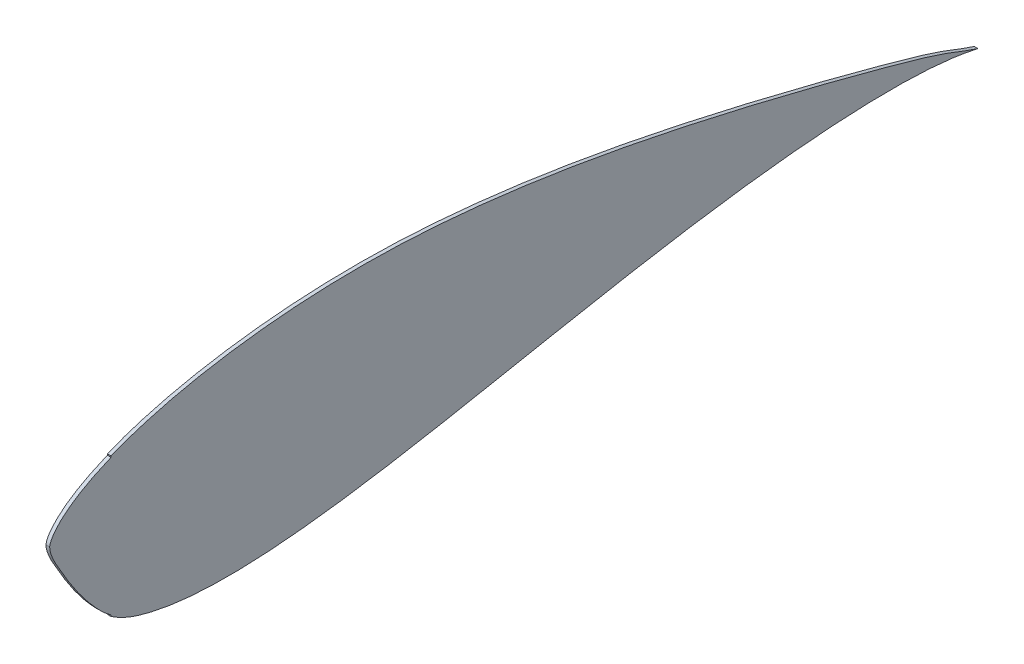
ISO-10303-21;
HEADER;
FILE_DESCRIPTION(('STEP AP214'),'2;1');
FILE_NAME('part.step','',(''),(''),'','','');
FILE_SCHEMA(('AUTOMOTIVE_DESIGN { 1 0 10303 214 1 1 1 1 }'));
ENDSEC;
DATA;
#1=APPLICATION_CONTEXT('core data for automotive mechanical design processes');
#2=APPLICATION_PROTOCOL_DEFINITION('international standard','automotive_design',2000,#1);
#3=PRODUCT_CONTEXT('',#1,'mechanical');
#4=PRODUCT('Part','Part','',(#3));
#5=PRODUCT_RELATED_PRODUCT_CATEGORY('part','',(#4));
#6=PRODUCT_DEFINITION_FORMATION('','',#4);
#7=PRODUCT_DEFINITION_CONTEXT('part definition',#1,'design');
#8=PRODUCT_DEFINITION('design','',#6,#7);
#9=PRODUCT_DEFINITION_SHAPE('','',#8);
#10=(LENGTH_UNIT() NAMED_UNIT(*) SI_UNIT(.MILLI.,.METRE.));
#11=(NAMED_UNIT(*) PLANE_ANGLE_UNIT() SI_UNIT($,.RADIAN.));
#12=(NAMED_UNIT(*) SI_UNIT($,.STERADIAN.) SOLID_ANGLE_UNIT());
#13=UNCERTAINTY_MEASURE_WITH_UNIT(LENGTH_MEASURE(1.E-05),#10,'distance_accuracy_value','');
#14=(GEOMETRIC_REPRESENTATION_CONTEXT(3) GLOBAL_UNCERTAINTY_ASSIGNED_CONTEXT((#13)) GLOBAL_UNIT_ASSIGNED_CONTEXT((#10,
#11,#12)) REPRESENTATION_CONTEXT('',''));
#15=CARTESIAN_POINT('',(0.,0.,0.));
#16=DIRECTION('',(0.,0.,1.));
#17=DIRECTION('',(1.,0.,0.));
#18=AXIS2_PLACEMENT_3D('',#15,#16,#17);
#19=CARTESIAN_POINT('',(263.525,0.,-53.975));
#20=DIRECTION('',(0.,0.,-1.));
#21=DIRECTION('',(0.,1.,0.));
#22=AXIS2_PLACEMENT_3D('',#19,#20,#21);
#23=PLANE('',#22);
#24=DIRECTION('',(0.,1.,0.));
#25=VECTOR('',#24,1.);
#26=CARTESIAN_POINT('',(266.7,0.,-53.975));
#27=LINE('',#26,#25);
#28=CARTESIAN_POINT('',(266.7,40.570467672655,-53.975));
#29=VERTEX_POINT('',#28);
#30=CARTESIAN_POINT('',(266.7,41.6510394030179,-53.975));
#31=VERTEX_POINT('',#30);
#32=EDGE_CURVE('E153',#29,#31,#27,.T.);
#33=ORIENTED_EDGE('',*,*,#32,.T.);
#34=DIRECTION('',(1.,0.,0.));
#35=VECTOR('',#34,1.);
#36=CARTESIAN_POINT('',(263.525,41.6510394030179,-53.975));
#37=LINE('',#36,#35);
#38=CARTESIAN_POINT('',(263.525,41.6510394030179,-53.975));
#39=VERTEX_POINT('',#38);
#40=EDGE_CURVE('E11',#39,#31,#37,.T.);
#41=ORIENTED_EDGE('',*,*,#40,.F.);
#42=DIRECTION('',(0.,1.,0.));
#43=VECTOR('',#42,1.);
#44=CARTESIAN_POINT('',(263.525,0.,-53.975));
#45=LINE('',#44,#43);
#46=CARTESIAN_POINT('',(263.525,40.570467672655,-53.975));
#47=VERTEX_POINT('',#46);
#48=EDGE_CURVE('E56',#47,#39,#45,.T.);
#49=ORIENTED_EDGE('',*,*,#48,.F.);
#50=DIRECTION('',(1.,0.,0.));
#51=VECTOR('',#50,1.);
#52=CARTESIAN_POINT('',(263.525,40.570467672655,-53.975));
#53=LINE('',#52,#51);
#54=EDGE_CURVE('E41',#47,#29,#53,.T.);
#55=ORIENTED_EDGE('',*,*,#54,.T.);
#56=EDGE_LOOP('',(#33,#41,#49,#55));
#57=FACE_BOUND('',#56,.T.);
#58=ADVANCED_FACE('F36',(#57),#23,.F.);
#59=CARTESIAN_POINT('',(263.525,-28.0117320332953,-802.151053398607));
#60=CARTESIAN_POINT('',(263.525,-27.710542123527,-801.137231832094));
#61=CARTESIAN_POINT('',(263.525,-26.5641562510043,-797.27843482904));
#62=CARTESIAN_POINT('',(263.525,-23.4586005929967,-789.357225955684));
#63=CARTESIAN_POINT('',(263.525,-18.6435790763375,-777.061460680268));
#64=CARTESIAN_POINT('',(263.525,-13.0400649658381,-760.581722213746));
#65=CARTESIAN_POINT('',(263.525,-7.12332820030123,-739.996750309993));
#66=CARTESIAN_POINT('',(263.525,-0.379813283345798,-715.577161880778));
#67=CARTESIAN_POINT('',(263.525,7.01302179783245,-687.646997388539));
#68=CARTESIAN_POINT('',(263.525,14.9584437350511,-656.683490082775));
#69=CARTESIAN_POINT('',(263.525,23.2583450492127,-623.158916560161));
#70=CARTESIAN_POINT('',(263.525,31.6943761736674,-587.549187867877));
#71=CARTESIAN_POINT('',(263.525,40.0261592775003,-550.319226889969));
#72=CARTESIAN_POINT('',(263.525,48.0016259470583,-511.914813654707));
#73=CARTESIAN_POINT('',(263.525,55.3745384751683,-472.761711336754));
#74=CARTESIAN_POINT('',(263.525,61.9127756172881,-433.262164148396));
#75=CARTESIAN_POINT('',(263.525,67.4048011857371,-393.795881301516));
#76=CARTESIAN_POINT('',(263.525,71.6551802592027,-354.719946084308));
#77=CARTESIAN_POINT('',(263.525,74.5356984509869,-316.356950184404));
#78=CARTESIAN_POINT('',(263.525,75.7535877143478,-278.931254813958));
#79=CARTESIAN_POINT('',(263.525,75.3938232859782,-242.699408929645));
#80=CARTESIAN_POINT('',(263.525,73.5466559514192,-207.870582877272));
#81=CARTESIAN_POINT('',(263.525,70.258980651523,-174.746776105035));
#82=CARTESIAN_POINT('',(263.525,65.7681833794804,-143.601377812826));
#83=CARTESIAN_POINT('',(263.525,60.1874606388379,-114.762118238718));
#84=CARTESIAN_POINT('',(263.525,53.6284711640925,-88.5344901534865));
#85=CARTESIAN_POINT('',(263.525,46.2382231047102,-65.1989800418067));
#86=CARTESIAN_POINT('',(263.525,38.1338729096646,-45.0005898028485));
#87=CARTESIAN_POINT('',(263.525,29.5092329049809,-28.1586169294181));
#88=CARTESIAN_POINT('',(263.525,20.5578270147304,-14.8710331109971));
#89=CARTESIAN_POINT('',(263.525,12.3132643572985,-6.1441914315733));
#90=CARTESIAN_POINT('',(263.525,6.17648660122838,-1.94810257769001));
#91=CARTESIAN_POINT('',(263.525,3.08412263305227,-0.639134364132099));
#92=CARTESIAN_POINT('',(263.525,1.6680303470529,-0.217045478268119));
#93=CARTESIAN_POINT('',(263.525,0.777840261416918,-0.0425630889701045));
#94=CARTESIAN_POINT('',(263.525,0.196310087268892,-0.0107420046483453));
#95=CARTESIAN_POINT('',(263.525,0.,0.));
#96=B_SPLINE_CURVE_WITH_KNOTS('',3,(#59,#60,#61,#62,#63,#64,#65,#66,#67,#68,#69,#70,#71,#72,#73,
#74,#75,#76,#77,#78,#79,#80,#81,#82,#83,#84,#85,#86,#87,#88,#89,#90,#91,#92,#93,#94,#95),
.UNSPECIFIED.,.F.,.F.,(4,1,1,1,1,1,1,1,1,1,1,1,1,1,1,1,1,1,1,1,1,1,1,1,1,1,1,1,1,1,1,1,1,1,4),
(0.,0.0038023449945569,0.0144724456001439,0.0305636248499039,0.0512990586437873,
0.0770284704780323,0.1075738110133,0.142399412839652,0.180921149261364,0.222524680037491,
0.266590974271359,0.312514686460119,0.359710118436383,0.407632336843648,0.455773216728113,
0.503669018265595,0.550900956266296,0.59709618330248,0.64197604819215,0.685511898484932,
0.727353251544964,0.767353583197193,0.805169064220494,0.840471251936796,0.872937278412314,
0.902335208905147,0.928425322985344,0.95111304623239,0.970252676129248,0.985871491026606,
0.993981783732224,0.996752649298779,0.997906779196307,0.999293380847839,1.),.UNSPECIFIED.);
#97=DIRECTION('',(1.,0.,0.));
#98=VECTOR('',#97,1.);
#99=SURFACE_OF_LINEAR_EXTRUSION('',#96,#98);
#100=CARTESIAN_POINT('',(266.7,-28.0117320332953,-802.151053398607));
#101=CARTESIAN_POINT('',(266.7,-27.710542123527,-801.137231832094));
#102=CARTESIAN_POINT('',(266.7,-26.5641562510043,-797.27843482904));
#103=CARTESIAN_POINT('',(266.7,-23.4586005929967,-789.357225955684));
#104=CARTESIAN_POINT('',(266.7,-18.6435790763375,-777.061460680268));
#105=CARTESIAN_POINT('',(266.7,-13.0400649658381,-760.581722213746));
#106=CARTESIAN_POINT('',(266.7,-7.12332820030123,-739.996750309993));
#107=CARTESIAN_POINT('',(266.7,-0.379813283345798,-715.577161880778));
#108=CARTESIAN_POINT('',(266.7,7.01302179783245,-687.646997388539));
#109=CARTESIAN_POINT('',(266.7,14.9584437350511,-656.683490082775));
#110=CARTESIAN_POINT('',(266.7,23.2583450492127,-623.158916560161));
#111=CARTESIAN_POINT('',(266.7,31.6943761736674,-587.549187867877));
#112=CARTESIAN_POINT('',(266.7,40.0261592775003,-550.319226889969));
#113=CARTESIAN_POINT('',(266.7,48.0016259470583,-511.914813654707));
#114=CARTESIAN_POINT('',(266.7,55.3745384751683,-472.761711336754));
#115=CARTESIAN_POINT('',(266.7,61.9127756172881,-433.262164148396));
#116=CARTESIAN_POINT('',(266.7,67.4048011857371,-393.795881301516));
#117=CARTESIAN_POINT('',(266.7,71.6551802592027,-354.719946084308));
#118=CARTESIAN_POINT('',(266.7,74.5356984509869,-316.356950184404));
#119=CARTESIAN_POINT('',(266.7,75.7535877143478,-278.931254813958));
#120=CARTESIAN_POINT('',(266.7,75.3938232859782,-242.699408929645));
#121=CARTESIAN_POINT('',(266.7,73.5466559514192,-207.870582877272));
#122=CARTESIAN_POINT('',(266.7,70.258980651523,-174.746776105035));
#123=CARTESIAN_POINT('',(266.7,65.7681833794804,-143.601377812826));
#124=CARTESIAN_POINT('',(266.7,60.1874606388379,-114.762118238718));
#125=CARTESIAN_POINT('',(266.7,53.6284711640925,-88.5344901534865));
#126=CARTESIAN_POINT('',(266.7,46.2382231047102,-65.1989800418067));
#127=CARTESIAN_POINT('',(266.7,38.1338729096646,-45.0005898028485));
#128=CARTESIAN_POINT('',(266.7,29.5092329049809,-28.1586169294181));
#129=CARTESIAN_POINT('',(266.7,20.5578270147304,-14.8710331109971));
#130=CARTESIAN_POINT('',(266.7,12.3132643572985,-6.1441914315733));
#131=CARTESIAN_POINT('',(266.7,6.17648660122838,-1.94810257769001));
#132=CARTESIAN_POINT('',(266.7,3.08412263305227,-0.639134364132099));
#133=CARTESIAN_POINT('',(266.7,1.6680303470529,-0.217045478268119));
#134=CARTESIAN_POINT('',(266.7,0.777840261416918,-0.0425630889701045));
#135=CARTESIAN_POINT('',(266.7,0.196310087268892,-0.0107420046483453));
#136=CARTESIAN_POINT('',(266.7,0.,0.));
#137=B_SPLINE_CURVE_WITH_KNOTS('',3,(#100,#101,#102,#103,#104,#105,#106,#107,#108,#109,#110,
#111,#112,#113,#114,#115,#116,#117,#118,#119,#120,#121,#122,#123,#124,#125,#126,#127,#128,#129,
#130,#131,#132,#133,#134,#135,#136),.UNSPECIFIED.,.F.,.F.,(4,1,1,1,1,1,1,1,1,1,1,1,1,1,1,1,1,1,
1,1,1,1,1,1,1,1,1,1,1,1,1,1,1,1,4),(0.,0.0038023449945569,0.0144724456001439,0.0305636248499039,
0.0512990586437873,0.0770284704780323,0.1075738110133,0.142399412839652,0.180921149261364,
0.222524680037491,0.266590974271359,0.312514686460119,0.359710118436383,0.407632336843648,
0.455773216728113,0.503669018265595,0.550900956266296,0.59709618330248,0.64197604819215,
0.685511898484932,0.727353251544964,0.767353583197193,0.805169064220494,0.840471251936796,
0.872937278412314,0.902335208905147,0.928425322985344,0.95111304623239,0.970252676129248,
0.985871491026606,0.993981783732224,0.996752649298779,0.997906779196307,0.999293380847839,1.),.UNSPECIFIED.);
#138=CARTESIAN_POINT('',(266.7,-28.0117320332953,-802.151053398607));
#139=VERTEX_POINT('',#138);
#140=EDGE_CURVE('E159',#139,#31,#137,.T.);
#141=ORIENTED_EDGE('',*,*,#140,.F.);
#142=DIRECTION('',(1.,0.,0.));
#143=VECTOR('',#142,1.);
#144=CARTESIAN_POINT('',(263.525,-28.0117320332953,-802.151053398607));
#145=LINE('',#144,#143);
#146=CARTESIAN_POINT('',(263.525,-28.0117320332953,-802.151053398607));
#147=VERTEX_POINT('',#146);
#148=EDGE_CURVE('E47',#147,#139,#145,.T.);
#149=ORIENTED_EDGE('',*,*,#148,.F.);
#150=EDGE_CURVE('E116',#147,#39,#96,.T.);
#151=ORIENTED_EDGE('',*,*,#150,.T.);
#152=ORIENTED_EDGE('',*,*,#40,.T.);
#153=EDGE_LOOP('',(#141,#149,#151,#152));
#154=FACE_BOUND('',#153,.T.);
#155=ADVANCED_FACE('F137',(#154),#99,.T.);
#156=CARTESIAN_POINT('',(263.525,0.,0.));
#157=CARTESIAN_POINT('',(263.525,-0.519005663292632,-0.0174520328861116));
#158=CARTESIAN_POINT('',(263.525,-1.83376590693266,-0.061662030289511));
#159=CARTESIAN_POINT('',(263.525,-4.39681155697538,-0.570189514846942));
#160=CARTESIAN_POINT('',(263.525,-10.616386461847,-2.53612961983818));
#161=CARTESIAN_POINT('',(263.525,-20.5501355548529,-7.99821180017807));
#162=CARTESIAN_POINT('',(263.525,-34.1849518234535,-16.113653600375));
#163=CARTESIAN_POINT('',(263.525,-48.9001609581786,-25.7512677237822));
#164=CARTESIAN_POINT('',(263.525,-62.9387722638163,-36.9320129206869));
#165=CARTESIAN_POINT('',(263.525,-75.9185649305712,-49.3363693896182));
#166=CARTESIAN_POINT('',(263.525,-85.624987008219,-65.2269065390065));
#167=CARTESIAN_POINT('',(263.525,-91.71735718507,-84.4527650462028));
#168=CARTESIAN_POINT('',(263.525,-96.1515107337894,-106.852134497523));
#169=CARTESIAN_POINT('',(263.525,-98.5722491750476,-132.510932075963));
#170=CARTESIAN_POINT('',(263.525,-99.0923828679645,-161.194365788224));
#171=CARTESIAN_POINT('',(263.525,-97.7042437107787,-192.761343292225));
#172=CARTESIAN_POINT('',(263.525,-94.5118392960459,-227.038217577419));
#173=CARTESIAN_POINT('',(263.525,-89.663828122523,-263.83475650239));
#174=CARTESIAN_POINT('',(263.525,-83.3884450275924,-302.921473177171));
#175=CARTESIAN_POINT('',(263.525,-75.9777868038423,-344.017776041379));
#176=CARTESIAN_POINT('',(263.525,-67.7807073824771,-386.776799789042));
#177=CARTESIAN_POINT('',(263.525,-59.2023239554423,-430.774614869895));
#178=CARTESIAN_POINT('',(263.525,-50.6638051202139,-475.496263681326));
#179=CARTESIAN_POINT('',(263.525,-42.603612471025,-520.335279967164));
#180=CARTESIAN_POINT('',(263.525,-35.4227963472458,-564.588870456427));
#181=CARTESIAN_POINT('',(263.525,-29.4733080838417,-607.47093439983));
#182=CARTESIAN_POINT('',(263.525,-25.014473383068,-648.127538759033));
#183=CARTESIAN_POINT('',(263.525,-22.1862417823146,-685.667615873141));
#184=CARTESIAN_POINT('',(263.525,-21.0047614095552,-719.196759596274));
#185=CARTESIAN_POINT('',(263.525,-21.2786363123237,-747.830287498204));
#186=CARTESIAN_POINT('',(263.525,-22.8547119223691,-770.688405742871));
#187=CARTESIAN_POINT('',(263.525,-25.0735156397946,-787.091395164099));
#188=CARTESIAN_POINT('',(263.525,-26.8193281874914,-796.842303094868));
#189=CARTESIAN_POINT('',(263.525,-27.775140745329,-801.097715575015));
#190=CARTESIAN_POINT('',(263.525,-28.0117320332953,-802.151053398607));
#191=B_SPLINE_CURVE_WITH_KNOTS('',3,(#156,#157,#158,#159,#160,#161,#162,#163,#164,#165,#166,
#167,#168,#169,#170,#171,#172,#173,#174,#175,#176,#177,#178,#179,#180,#181,#182,#183,#184,#185,
#186,#187,#188,#189,#190),.UNSPECIFIED.,.F.,.F.,(4,1,1,1,1,1,1,1,1,1,1,1,1,1,1,1,1,1,1,1,1,1,1,
1,1,1,1,1,1,1,1,1,4),(0.,0.00182090933464196,0.00461278049497482,0.00913453013845994,
0.0246759391487866,0.0441527676320363,0.064937102928184,0.0863209881898911,0.107137618403306,
0.127599776801144,0.150892792929449,0.177565203441126,0.207667777211646,0.241222088418686,
0.278203414074027,0.318526302563412,0.362030578586225,0.408464624639153,0.457479061609077,
0.508614437318857,0.56129601455956,0.61483529472868,0.668437533813961,0.721214466101836,
0.772202341152847,0.82039348306447,0.86476592329606,0.904323703961063,0.938131580580512,
0.965241743376092,0.984690446789536,0.996210442222917,1.),.UNSPECIFIED.);
#192=DIRECTION('',(1.,0.,0.));
#193=VECTOR('',#192,1.);
#194=SURFACE_OF_LINEAR_EXTRUSION('',#191,#193);
#195=CARTESIAN_POINT('',(266.7,0.,0.));
#196=CARTESIAN_POINT('',(266.7,-0.519005663292632,-0.0174520328861116));
#197=CARTESIAN_POINT('',(266.7,-1.83376590693266,-0.061662030289511));
#198=CARTESIAN_POINT('',(266.7,-4.39681155697538,-0.570189514846942));
#199=CARTESIAN_POINT('',(266.7,-10.616386461847,-2.53612961983818));
#200=CARTESIAN_POINT('',(266.7,-20.5501355548529,-7.99821180017807));
#201=CARTESIAN_POINT('',(266.7,-34.1849518234535,-16.113653600375));
#202=CARTESIAN_POINT('',(266.7,-48.9001609581786,-25.7512677237822));
#203=CARTESIAN_POINT('',(266.7,-62.9387722638163,-36.9320129206869));
#204=CARTESIAN_POINT('',(266.7,-75.9185649305712,-49.3363693896182));
#205=CARTESIAN_POINT('',(266.7,-85.624987008219,-65.2269065390065));
#206=CARTESIAN_POINT('',(266.7,-91.71735718507,-84.4527650462028));
#207=CARTESIAN_POINT('',(266.7,-96.1515107337894,-106.852134497523));
#208=CARTESIAN_POINT('',(266.7,-98.5722491750476,-132.510932075963));
#209=CARTESIAN_POINT('',(266.7,-99.0923828679645,-161.194365788224));
#210=CARTESIAN_POINT('',(266.7,-97.7042437107787,-192.761343292225));
#211=CARTESIAN_POINT('',(266.7,-94.5118392960459,-227.038217577419));
#212=CARTESIAN_POINT('',(266.7,-89.663828122523,-263.83475650239));
#213=CARTESIAN_POINT('',(266.7,-83.3884450275924,-302.921473177171));
#214=CARTESIAN_POINT('',(266.7,-75.9777868038423,-344.017776041379));
#215=CARTESIAN_POINT('',(266.7,-67.7807073824771,-386.776799789042));
#216=CARTESIAN_POINT('',(266.7,-59.2023239554423,-430.774614869895));
#217=CARTESIAN_POINT('',(266.7,-50.6638051202139,-475.496263681326));
#218=CARTESIAN_POINT('',(266.7,-42.603612471025,-520.335279967164));
#219=CARTESIAN_POINT('',(266.7,-35.4227963472458,-564.588870456427));
#220=CARTESIAN_POINT('',(266.7,-29.4733080838417,-607.47093439983));
#221=CARTESIAN_POINT('',(266.7,-25.014473383068,-648.127538759033));
#222=CARTESIAN_POINT('',(266.7,-22.1862417823146,-685.667615873141));
#223=CARTESIAN_POINT('',(266.7,-21.0047614095552,-719.196759596274));
#224=CARTESIAN_POINT('',(266.7,-21.2786363123237,-747.830287498204));
#225=CARTESIAN_POINT('',(266.7,-22.8547119223691,-770.688405742871));
#226=CARTESIAN_POINT('',(266.7,-25.0735156397946,-787.091395164099));
#227=CARTESIAN_POINT('',(266.7,-26.8193281874914,-796.842303094868));
#228=CARTESIAN_POINT('',(266.7,-27.775140745329,-801.097715575015));
#229=CARTESIAN_POINT('',(266.7,-28.0117320332953,-802.151053398607));
#230=B_SPLINE_CURVE_WITH_KNOTS('',3,(#195,#196,#197,#198,#199,#200,#201,#202,#203,#204,#205,
#206,#207,#208,#209,#210,#211,#212,#213,#214,#215,#216,#217,#218,#219,#220,#221,#222,#223,#224,
#225,#226,#227,#228,#229),.UNSPECIFIED.,.F.,.F.,(4,1,1,1,1,1,1,1,1,1,1,1,1,1,1,1,1,1,1,1,1,1,1,
1,1,1,1,1,1,1,1,1,4),(0.,0.00182090933464196,0.00461278049497482,0.00913453013845994,
0.0246759391487866,0.0441527676320363,0.064937102928184,0.0863209881898911,0.107137618403306,
0.127599776801144,0.150892792929449,0.177565203441126,0.207667777211646,0.241222088418686,
0.278203414074027,0.318526302563412,0.362030578586225,0.408464624639153,0.457479061609077,
0.508614437318857,0.56129601455956,0.61483529472868,0.668437533813961,0.721214466101836,
0.772202341152847,0.82039348306447,0.86476592329606,0.904323703961063,0.938131580580512,
0.965241743376092,0.984690446789536,0.996210442222917,1.),.UNSPECIFIED.);
#231=CARTESIAN_POINT('',(266.7,-78.4194122065667,-53.975));
#232=VERTEX_POINT('',#231);
#233=EDGE_CURVE('E102',#232,#139,#230,.T.);
#234=ORIENTED_EDGE('',*,*,#233,.F.);
#235=DIRECTION('',(1.,0.,0.));
#236=VECTOR('',#235,1.);
#237=CARTESIAN_POINT('',(263.525,-78.4194122065667,-53.975));
#238=LINE('',#237,#236);
#239=CARTESIAN_POINT('',(263.525,-78.4194122065667,-53.975));
#240=VERTEX_POINT('',#239);
#241=EDGE_CURVE('E97',#240,#232,#238,.T.);
#242=ORIENTED_EDGE('',*,*,#241,.F.);
#243=EDGE_CURVE('E101',#240,#147,#191,.T.);
#244=ORIENTED_EDGE('',*,*,#243,.T.);
#245=ORIENTED_EDGE('',*,*,#148,.T.);
#246=EDGE_LOOP('',(#234,#242,#244,#245));
#247=FACE_BOUND('',#246,.T.);
#248=ADVANCED_FACE('F99',(#247),#194,.T.);
#249=CARTESIAN_POINT('',(266.7,-77.204508026341,-53.975));
#250=VERTEX_POINT('',#249);
#251=EDGE_CURVE('E158',#232,#250,#27,.T.);
#252=ORIENTED_EDGE('',*,*,#251,.T.);
#253=DIRECTION('',(1.,0.,0.));
#254=VECTOR('',#253,1.);
#255=CARTESIAN_POINT('',(263.525,-77.204508026341,-53.975));
#256=LINE('',#255,#254);
#257=CARTESIAN_POINT('',(263.525,-77.204508026341,-53.975));
#258=VERTEX_POINT('',#257);
#259=EDGE_CURVE('E106',#258,#250,#256,.T.);
#260=ORIENTED_EDGE('',*,*,#259,.F.);
#261=EDGE_CURVE('E109',#240,#258,#45,.T.);
#262=ORIENTED_EDGE('',*,*,#261,.F.);
#263=ORIENTED_EDGE('',*,*,#241,.T.);
#264=EDGE_LOOP('',(#252,#260,#262,#263));
#265=FACE_BOUND('',#264,.T.);
#266=ADVANCED_FACE('F110',(#265),#23,.F.);
#267=CARTESIAN_POINT('',(263.525,-0.0105715755314952,-1.00092143014072));
#268=CARTESIAN_POINT('',(263.525,-0.277884036060372,-1.00992386551348));
#269=CARTESIAN_POINT('',(263.525,-0.82336349737026,-1.02892742735891));
#270=CARTESIAN_POINT('',(263.525,-1.82586034380813,-1.10276858286475));
#271=CARTESIAN_POINT('',(263.525,-3.59720494899299,-1.4167603135489));
#272=CARTESIAN_POINT('',(263.525,-7.20319725120049,-2.45215176987059));
#273=CARTESIAN_POINT('',(263.525,-12.1314464463791,-4.55769079248071));
#274=CARTESIAN_POINT('',(263.525,-17.8738385201099,-7.69425284344568));
#275=CARTESIAN_POINT('',(263.525,-25.4664015014938,-12.0814520231865));
#276=CARTESIAN_POINT('',(263.525,-34.7964706097256,-17.7321892452926));
#277=CARTESIAN_POINT('',(263.525,-45.768224894245,-24.9199190416554));
#278=CARTESIAN_POINT('',(263.525,-54.4810001725707,-31.4576403541694));
#279=CARTESIAN_POINT('',(263.525,-61.1825460696,-37.0476352526978));
#280=CARTESIAN_POINT('',(263.525,-67.7200363722696,-42.8536107430807));
#281=CARTESIAN_POINT('',(263.525,-75.2474252014325,-50.654483138517));
#282=CARTESIAN_POINT('',(263.525,-82.3375767862836,-61.6336997751224));
#283=CARTESIAN_POINT('',(263.525,-87.3558293333517,-73.6522333197614));
#284=CARTESIAN_POINT('',(263.525,-90.8757435664219,-86.2831450622461));
#285=CARTESIAN_POINT('',(263.525,-93.5961282597505,-99.0883228165563));
#286=CARTESIAN_POINT('',(263.525,-96.1812979180947,-116.355565047099));
#287=CARTESIAN_POINT('',(263.525,-97.7922955064102,-138.172355406189));
#288=CARTESIAN_POINT('',(263.525,-97.9545678953342,-164.414746231071));
#289=CARTESIAN_POINT('',(263.525,-96.7472497650845,-190.644177549097));
#290=CARTESIAN_POINT('',(263.525,-94.5068019572299,-216.810357889896));
#291=CARTESIAN_POINT('',(263.525,-91.4627733292833,-242.901103816225));
#292=CARTESIAN_POINT('',(263.525,-86.5747820988504,-277.588933530882));
#293=CARTESIAN_POINT('',(263.525,-79.2929562916147,-320.780252206704));
#294=CARTESIAN_POINT('',(263.525,-69.5596593720213,-372.441575216412));
#295=CARTESIAN_POINT('',(263.525,-59.4829282355896,-424.0474621233));
#296=CARTESIAN_POINT('',(263.525,-49.582238647307,-475.697372047233));
#297=CARTESIAN_POINT('',(263.525,-40.3239613574794,-527.476766143212));
#298=CARTESIAN_POINT('',(263.525,-32.1431436322042,-579.449120689071));
#299=CARTESIAN_POINT('',(263.525,-25.5196831515598,-631.656276836981));
#300=CARTESIAN_POINT('',(263.525,-21.7598230516541,-675.368117845363));
#301=CARTESIAN_POINT('',(263.525,-20.2591982611289,-710.439676765268));
#302=CARTESIAN_POINT('',(263.525,-20.0352605308658,-736.775033352294));
#303=CARTESIAN_POINT('',(263.525,-21.0631783664124,-763.122854811444));
#304=CARTESIAN_POINT('',(263.525,-23.1009863952982,-780.61402572874));
#305=CARTESIAN_POINT('',(263.525,-24.5074523147149,-789.290776610833));
#306=B_SPLINE_CURVE_WITH_KNOTS('',3,(#267,#268,#269,#270,#271,#272,#273,#274,#275,#276,#277,
#278,#279,#280,#281,#282,#283,#284,#285,#286,#287,#288,#289,#290,#291,#292,#293,#294,#295,#296,
#297,#298,#299,#300,#301,#302,#303,#304,#305),.UNSPECIFIED.,.F.,.F.,(4,1,1,1,1,1,1,1,1,1,1,1,1,
1,1,1,1,1,1,1,1,1,1,1,1,1,1,1,1,1,1,1,1,1,1,1,4),(5.17265244499306E-05,0.00101308314360884,
0.00197443976276775,0.00389715300108556,0.00774257947772119,0.0154334324309925,
0.0231242853842637,0.030815138337535,0.0461968442440775,0.06157855015062,0.0769602560571625,
0.0846511090104338,0.0923419619637051,0.107723667870248,0.12310537377679,0.138487079683333,
0.153868785589875,0.169250491496418,0.18463219740296,0.215395609216045,0.24615902102913,
0.276922432842215,0.3076858446553,0.338449256468385,0.36921266828147,0.43073949190764,
0.492266315533811,0.553793139159981,0.615319962786151,0.676846786412321,0.738373610038491,
0.799900433664661,0.861427257290831,0.892190669103916,0.922954080917001,0.953717492730086,
0.984480904543171),.UNSPECIFIED.);
#307=DIRECTION('',(1.,0.,0.));
#308=VECTOR('',#307,1.);
#309=SURFACE_OF_LINEAR_EXTRUSION('',#306,#308);
#310=CARTESIAN_POINT('',(266.7,-0.0105715755314952,-1.00092143014072));
#311=CARTESIAN_POINT('',(266.7,-0.277884036060372,-1.00992386551348));
#312=CARTESIAN_POINT('',(266.7,-0.82336349737026,-1.02892742735891));
#313=CARTESIAN_POINT('',(266.7,-1.82586034380813,-1.10276858286475));
#314=CARTESIAN_POINT('',(266.7,-3.59720494899299,-1.4167603135489));
#315=CARTESIAN_POINT('',(266.7,-7.20319725120049,-2.45215176987059));
#316=CARTESIAN_POINT('',(266.7,-12.1314464463791,-4.55769079248071));
#317=CARTESIAN_POINT('',(266.7,-17.8738385201099,-7.69425284344568));
#318=CARTESIAN_POINT('',(266.7,-25.4664015014938,-12.0814520231865));
#319=CARTESIAN_POINT('',(266.7,-34.7964706097256,-17.7321892452926));
#320=CARTESIAN_POINT('',(266.7,-45.768224894245,-24.9199190416554));
#321=CARTESIAN_POINT('',(266.7,-54.4810001725707,-31.4576403541694));
#322=CARTESIAN_POINT('',(266.7,-61.1825460696,-37.0476352526978));
#323=CARTESIAN_POINT('',(266.7,-67.7200363722696,-42.8536107430807));
#324=CARTESIAN_POINT('',(266.7,-75.2474252014325,-50.654483138517));
#325=CARTESIAN_POINT('',(266.7,-82.3375767862836,-61.6336997751224));
#326=CARTESIAN_POINT('',(266.7,-87.3558293333517,-73.6522333197614));
#327=CARTESIAN_POINT('',(266.7,-90.8757435664219,-86.2831450622461));
#328=CARTESIAN_POINT('',(266.7,-93.5961282597505,-99.0883228165563));
#329=CARTESIAN_POINT('',(266.7,-96.1812979180947,-116.355565047099));
#330=CARTESIAN_POINT('',(266.7,-97.7922955064102,-138.172355406189));
#331=CARTESIAN_POINT('',(266.7,-97.9545678953342,-164.414746231071));
#332=CARTESIAN_POINT('',(266.7,-96.7472497650845,-190.644177549097));
#333=CARTESIAN_POINT('',(266.7,-94.5068019572299,-216.810357889896));
#334=CARTESIAN_POINT('',(266.7,-91.4627733292833,-242.901103816225));
#335=CARTESIAN_POINT('',(266.7,-86.5747820988504,-277.588933530882));
#336=CARTESIAN_POINT('',(266.7,-79.2929562916147,-320.780252206704));
#337=CARTESIAN_POINT('',(266.7,-69.5596593720213,-372.441575216412));
#338=CARTESIAN_POINT('',(266.7,-59.4829282355896,-424.0474621233));
#339=CARTESIAN_POINT('',(266.7,-49.582238647307,-475.697372047233));
#340=CARTESIAN_POINT('',(266.7,-40.3239613574794,-527.476766143212));
#341=CARTESIAN_POINT('',(266.7,-32.1431436322042,-579.449120689071));
#342=CARTESIAN_POINT('',(266.7,-25.5196831515598,-631.656276836981));
#343=CARTESIAN_POINT('',(266.7,-21.7598230516541,-675.368117845363));
#344=CARTESIAN_POINT('',(266.7,-20.2591982611289,-710.439676765268));
#345=CARTESIAN_POINT('',(266.7,-20.0352605308658,-736.775033352294));
#346=CARTESIAN_POINT('',(266.7,-21.0631783664124,-763.122854811444));
#347=CARTESIAN_POINT('',(266.7,-23.1009863952982,-780.61402572874));
#348=CARTESIAN_POINT('',(266.7,-24.5074523147149,-789.290776610833));
#349=B_SPLINE_CURVE_WITH_KNOTS('',3,(#310,#311,#312,#313,#314,#315,#316,#317,#318,#319,#320,
#321,#322,#323,#324,#325,#326,#327,#328,#329,#330,#331,#332,#333,#334,#335,#336,#337,#338,#339,
#340,#341,#342,#343,#344,#345,#346,#347,#348),.UNSPECIFIED.,.F.,.F.,(4,1,1,1,1,1,1,1,1,1,1,1,1,
1,1,1,1,1,1,1,1,1,1,1,1,1,1,1,1,1,1,1,1,1,1,1,4),(5.17265244499306E-05,0.00101308314360884,
0.00197443976276775,0.00389715300108556,0.00774257947772119,0.0154334324309925,
0.0231242853842637,0.030815138337535,0.0461968442440775,0.06157855015062,0.0769602560571625,
0.0846511090104338,0.0923419619637051,0.107723667870248,0.12310537377679,0.138487079683333,
0.153868785589875,0.169250491496418,0.18463219740296,0.215395609216045,0.24615902102913,
0.276922432842215,0.3076858446553,0.338449256468385,0.36921266828147,0.43073949190764,
0.492266315533811,0.553793139159981,0.615319962786151,0.676846786412321,0.738373610038491,
0.799900433664661,0.861427257290831,0.892190669103916,0.922954080917001,0.953717492730086,
0.984480904543171),.UNSPECIFIED.);
#350=CARTESIAN_POINT('',(266.7,-0.0105715755317708,-1.00092143014071));
#351=VERTEX_POINT('',#350);
#352=EDGE_CURVE('E176',#351,#250,#349,.T.);
#353=ORIENTED_EDGE('',*,*,#352,.F.);
#354=DIRECTION('',(1.,0.,0.));
#355=VECTOR('',#354,1.);
#356=CARTESIAN_POINT('',(263.525,-0.0105715755317708,-1.00092143014071));
#357=LINE('',#356,#355);
#358=CARTESIAN_POINT('',(263.525,-0.0105715755317708,-1.00092143014071));
#359=VERTEX_POINT('',#358);
#360=EDGE_CURVE('E174',#359,#351,#357,.T.);
#361=ORIENTED_EDGE('',*,*,#360,.F.);
#362=EDGE_CURVE('E113',#359,#258,#306,.T.);
#363=ORIENTED_EDGE('',*,*,#362,.T.);
#364=ORIENTED_EDGE('',*,*,#259,.T.);
#365=EDGE_LOOP('',(#353,#361,#363,#364));
#366=FACE_BOUND('',#365,.T.);
#367=ADVANCED_FACE('F140',(#366),#309,.T.);
#368=CARTESIAN_POINT('',(263.525,-24.5074523147149,-789.290776610833));
#369=CARTESIAN_POINT('',(263.525,-22.9508744367013,-785.316343884076));
#370=CARTESIAN_POINT('',(263.525,-19.8539626401927,-777.355397182078));
#371=CARTESIAN_POINT('',(263.525,-14.2813269120629,-761.239372327148));
#372=CARTESIAN_POINT('',(263.525,-8.35597741402669,-740.721760986468));
#373=CARTESIAN_POINT('',(263.525,-1.53568705011438,-715.996407484722));
#374=CARTESIAN_POINT('',(263.525,5.03900213458998,-691.207801971334));
#375=CARTESIAN_POINT('',(263.525,11.4508501691391,-666.372562229981));
#376=CARTESIAN_POINT('',(263.525,19.7880443068953,-633.206673978885));
#377=CARTESIAN_POINT('',(263.525,29.7875796313035,-591.645299060978));
#378=CARTESIAN_POINT('',(263.525,40.9550759630107,-541.582090396035));
#379=CARTESIAN_POINT('',(263.525,51.059120386154,-491.296768227991));
#380=CARTESIAN_POINT('',(263.525,59.8424532201647,-440.766906741374));
#381=CARTESIAN_POINT('',(263.525,66.9977710701701,-389.985550008335));
#382=CARTESIAN_POINT('',(263.525,71.320315093406,-347.467968433537));
#383=CARTESIAN_POINT('',(263.525,73.5458835501345,-313.365429537516));
#384=CARTESIAN_POINT('',(263.525,74.7799917159271,-279.21395742446));
#385=CARTESIAN_POINT('',(263.525,74.5203773652254,-245.029770666932));
#386=CARTESIAN_POINT('',(263.525,72.6538287923752,-210.910401752373));
#387=CARTESIAN_POINT('',(263.525,70.3743898225911,-185.386352949068));
#388=CARTESIAN_POINT('',(263.525,67.2137954131363,-159.955473188296));
#389=CARTESIAN_POINT('',(263.525,63.1155980063945,-134.662568023428));
#390=CARTESIAN_POINT('',(263.525,57.945664824236,-109.57149725794));
#391=CARTESIAN_POINT('',(263.525,52.5847511620715,-88.9109656463125));
#392=CARTESIAN_POINT('',(263.525,47.5157638070041,-72.6183415034526));
#393=CARTESIAN_POINT('',(263.525,43.2586969489353,-60.5546834115465));
#394=CARTESIAN_POINT('',(263.525,38.4699964176601,-48.7006014884342));
#395=CARTESIAN_POINT('',(263.525,33.0526676620866,-37.1258569671738));
#396=CARTESIAN_POINT('',(263.525,27.8818614287451,-27.830126078208));
#397=CARTESIAN_POINT('',(263.525,23.2421045519939,-20.7190918518584));
#398=CARTESIAN_POINT('',(263.525,19.4551370279139,-15.6144955117341));
#399=CARTESIAN_POINT('',(263.525,15.322063664281,-10.7866635242817));
#400=CARTESIAN_POINT('',(263.525,10.7521215765983,-6.42954397937692));
#401=CARTESIAN_POINT('',(263.525,6.52065180860318,-3.32978123179313));
#402=CARTESIAN_POINT('',(263.525,3.2894164680873,-1.76639425342375));
#403=CARTESIAN_POINT('',(263.525,1.62955235710493,-1.23457992726385));
#404=CARTESIAN_POINT('',(263.525,0.80849614820322,-1.07091770373055));
#405=CARTESIAN_POINT('',(263.525,0.373573872306364,-1.02268014491042));
#406=CARTESIAN_POINT('',(263.525,0.114040657530818,-1.00777338993929));
#407=CARTESIAN_POINT('',(263.525,-0.0105715755317708,-1.00092143014071));
#408=B_SPLINE_CURVE_WITH_KNOTS('',3,(#368,#369,#370,#371,#372,#373,#374,#375,#376,#377,#378,
#379,#380,#381,#382,#383,#384,#385,#386,#387,#388,#389,#390,#391,#392,#393,#394,#395,#396,#397,
#398,#399,#400,#401,#402,#403,#404,#405,#406,#407),.UNSPECIFIED.,.F.,.F.,(4,1,1,1,1,1,1,1,1,1,1,
1,1,1,1,1,1,1,1,1,1,1,1,1,1,1,1,1,1,1,1,1,1,1,1,1,1,4),(0.015898222635917,0.0312739817943403,
0.0466497409527635,0.0774012592696099,0.108152777586456,0.138904295903303,0.169655814220149,
0.200407332536996,0.261910369170689,0.323413405804382,0.384916442438074,0.446419479071767,
0.50792251570546,0.569425552339153,0.600177070656,0.630928588972846,0.692431625606539,
0.723183143923385,0.753934662240232,0.784686180557078,0.815437698873925,0.846189217190771,
0.876940735507618,0.892316494666041,0.907692253824464,0.923068012982887,0.938443772141311,
0.953819531299734,0.961507410878945,0.969195290458157,0.976883170037369,0.98457104961658,
0.992258929195792,0.996102868985398,0.998024838880201,0.998985823827602,0.999466316301303,
0.999946808775004),.UNSPECIFIED.);
#409=DIRECTION('',(1.,0.,0.));
#410=VECTOR('',#409,1.);
#411=SURFACE_OF_LINEAR_EXTRUSION('',#408,#410);
#412=CARTESIAN_POINT('',(266.7,-24.5074523147149,-789.290776610833));
#413=CARTESIAN_POINT('',(266.7,-22.9508744367013,-785.316343884076));
#414=CARTESIAN_POINT('',(266.7,-19.8539626401927,-777.355397182078));
#415=CARTESIAN_POINT('',(266.7,-14.2813269120629,-761.239372327148));
#416=CARTESIAN_POINT('',(266.7,-8.35597741402669,-740.721760986468));
#417=CARTESIAN_POINT('',(266.7,-1.53568705011438,-715.996407484722));
#418=CARTESIAN_POINT('',(266.7,5.03900213458998,-691.207801971334));
#419=CARTESIAN_POINT('',(266.7,11.4508501691391,-666.372562229981));
#420=CARTESIAN_POINT('',(266.7,19.7880443068953,-633.206673978885));
#421=CARTESIAN_POINT('',(266.7,29.7875796313035,-591.645299060978));
#422=CARTESIAN_POINT('',(266.7,40.9550759630107,-541.582090396035));
#423=CARTESIAN_POINT('',(266.7,51.059120386154,-491.296768227991));
#424=CARTESIAN_POINT('',(266.7,59.8424532201647,-440.766906741374));
#425=CARTESIAN_POINT('',(266.7,66.9977710701701,-389.985550008335));
#426=CARTESIAN_POINT('',(266.7,71.320315093406,-347.467968433537));
#427=CARTESIAN_POINT('',(266.7,73.5458835501345,-313.365429537516));
#428=CARTESIAN_POINT('',(266.7,74.7799917159271,-279.21395742446));
#429=CARTESIAN_POINT('',(266.7,74.5203773652254,-245.029770666932));
#430=CARTESIAN_POINT('',(266.7,72.6538287923752,-210.910401752373));
#431=CARTESIAN_POINT('',(266.7,70.3743898225911,-185.386352949068));
#432=CARTESIAN_POINT('',(266.7,67.2137954131363,-159.955473188296));
#433=CARTESIAN_POINT('',(266.7,63.1155980063945,-134.662568023428));
#434=CARTESIAN_POINT('',(266.7,57.945664824236,-109.57149725794));
#435=CARTESIAN_POINT('',(266.7,52.5847511620715,-88.9109656463125));
#436=CARTESIAN_POINT('',(266.7,47.5157638070041,-72.6183415034526));
#437=CARTESIAN_POINT('',(266.7,43.2586969489353,-60.5546834115465));
#438=CARTESIAN_POINT('',(266.7,38.4699964176601,-48.7006014884342));
#439=CARTESIAN_POINT('',(266.7,33.0526676620866,-37.1258569671738));
#440=CARTESIAN_POINT('',(266.7,27.8818614287451,-27.830126078208));
#441=CARTESIAN_POINT('',(266.7,23.2421045519939,-20.7190918518584));
#442=CARTESIAN_POINT('',(266.7,19.4551370279139,-15.6144955117341));
#443=CARTESIAN_POINT('',(266.7,15.322063664281,-10.7866635242817));
#444=CARTESIAN_POINT('',(266.7,10.7521215765983,-6.42954397937692));
#445=CARTESIAN_POINT('',(266.7,6.52065180860318,-3.32978123179313));
#446=CARTESIAN_POINT('',(266.7,3.2894164680873,-1.76639425342375));
#447=CARTESIAN_POINT('',(266.7,1.62955235710493,-1.23457992726385));
#448=CARTESIAN_POINT('',(266.7,0.80849614820322,-1.07091770373055));
#449=CARTESIAN_POINT('',(266.7,0.373573872306364,-1.02268014491042));
#450=CARTESIAN_POINT('',(266.7,0.114040657530818,-1.00777338993929));
#451=CARTESIAN_POINT('',(266.7,-0.0105715755317708,-1.00092143014071));
#452=B_SPLINE_CURVE_WITH_KNOTS('',3,(#412,#413,#414,#415,#416,#417,#418,#419,#420,#421,#422,
#423,#424,#425,#426,#427,#428,#429,#430,#431,#432,#433,#434,#435,#436,#437,#438,#439,#440,#441,
#442,#443,#444,#445,#446,#447,#448,#449,#450,#451),.UNSPECIFIED.,.F.,.F.,(4,1,1,1,1,1,1,1,1,1,1,
1,1,1,1,1,1,1,1,1,1,1,1,1,1,1,1,1,1,1,1,1,1,1,1,1,1,4),(0.015898222635917,0.0312739817943403,
0.0466497409527635,0.0774012592696099,0.108152777586456,0.138904295903303,0.169655814220149,
0.200407332536996,0.261910369170689,0.323413405804382,0.384916442438074,0.446419479071767,
0.50792251570546,0.569425552339153,0.600177070656,0.630928588972846,0.692431625606539,
0.723183143923385,0.753934662240232,0.784686180557078,0.815437698873925,0.846189217190771,
0.876940735507618,0.892316494666041,0.907692253824464,0.923068012982887,0.938443772141311,
0.953819531299734,0.961507410878945,0.969195290458157,0.976883170037369,0.98457104961658,
0.992258929195792,0.996102868985398,0.998024838880201,0.998985823827602,0.999466316301303,
0.999946808775004),.UNSPECIFIED.);
#453=EDGE_CURVE('E157',#29,#351,#452,.T.);
#454=ORIENTED_EDGE('',*,*,#453,.F.);
#455=ORIENTED_EDGE('',*,*,#54,.F.);
#456=EDGE_CURVE('E162',#47,#359,#408,.T.);
#457=ORIENTED_EDGE('',*,*,#456,.T.);
#458=ORIENTED_EDGE('',*,*,#360,.T.);
#459=EDGE_LOOP('',(#454,#455,#457,#458));
#460=FACE_BOUND('',#459,.T.);
#461=ADVANCED_FACE('F38',(#460),#411,.T.);
#462=CARTESIAN_POINT('',(263.525,0.,0.));
#463=DIRECTION('',(1.,0.,0.));
#464=DIRECTION('',(0.,0.,-1.));
#465=AXIS2_PLACEMENT_3D('',#462,#463,#464);
#466=PLANE('',#465);
#467=ORIENTED_EDGE('',*,*,#48,.T.);
#468=ORIENTED_EDGE('',*,*,#150,.F.);
#469=ORIENTED_EDGE('',*,*,#243,.F.);
#470=ORIENTED_EDGE('',*,*,#261,.T.);
#471=ORIENTED_EDGE('',*,*,#362,.F.);
#472=ORIENTED_EDGE('',*,*,#456,.F.);
#473=EDGE_LOOP('',(#467,#468,#469,#470,#471,#472));
#474=FACE_BOUND('',#473,.T.);
#475=ADVANCED_FACE('F115',(#474),#466,.F.);
#476=CARTESIAN_POINT('',(266.7,0.,0.));
#477=DIRECTION('',(1.,0.,0.));
#478=DIRECTION('',(0.,0.,-1.));
#479=AXIS2_PLACEMENT_3D('',#476,#477,#478);
#480=PLANE('',#479);
#481=ORIENTED_EDGE('',*,*,#32,.F.);
#482=ORIENTED_EDGE('',*,*,#453,.T.);
#483=ORIENTED_EDGE('',*,*,#352,.T.);
#484=ORIENTED_EDGE('',*,*,#251,.F.);
#485=ORIENTED_EDGE('',*,*,#233,.T.);
#486=ORIENTED_EDGE('',*,*,#140,.T.);
#487=EDGE_LOOP('',(#481,#482,#483,#484,#485,#486));
#488=FACE_BOUND('',#487,.T.);
#489=ADVANCED_FACE('F160',(#488),#480,.T.);
#490=CLOSED_SHELL('',(#58,#155,#248,#266,#367,#461,#475,#489));
#491=MANIFOLD_SOLID_BREP('B2',#490);
#492=ADVANCED_BREP_SHAPE_REPRESENTATION('',(#18,#491),#14);
#493=SHAPE_DEFINITION_REPRESENTATION(#9,#492);
ENDSEC;
END-ISO-10303-21;
